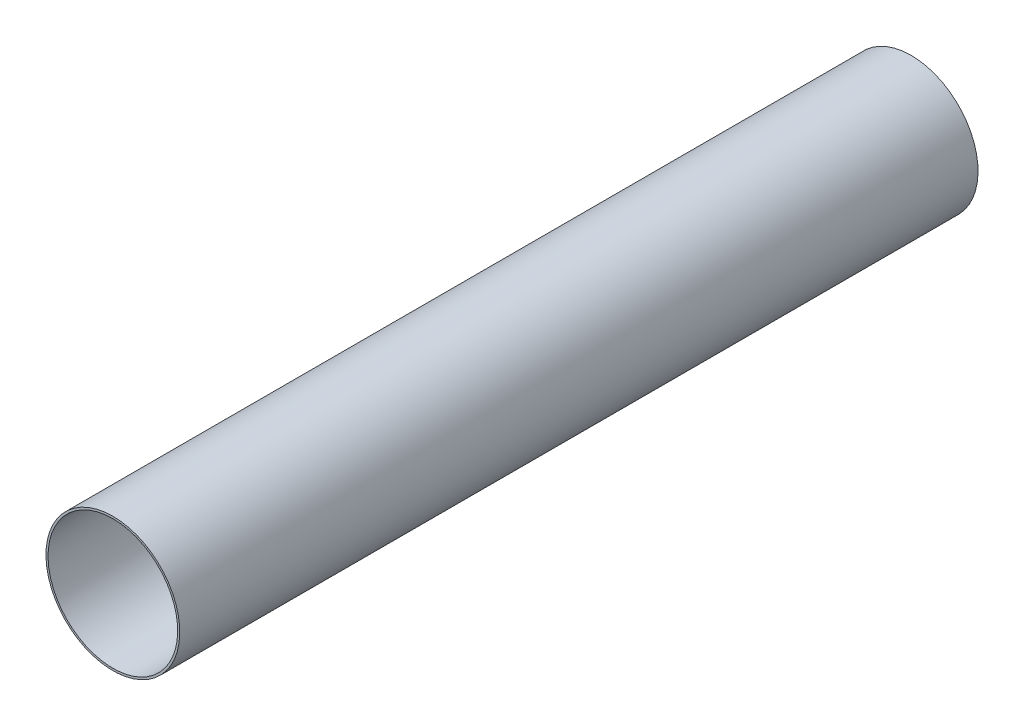
ISO-10303-21;
HEADER;
FILE_DESCRIPTION(('STEP AP214'),'2;1');
FILE_NAME('part.step','',(''),(''),'','','');
FILE_SCHEMA(('AUTOMOTIVE_DESIGN { 1 0 10303 214 1 1 1 1 }'));
ENDSEC;
DATA;
#1=APPLICATION_CONTEXT('core data for automotive mechanical design processes');
#2=APPLICATION_PROTOCOL_DEFINITION('international standard','automotive_design',2000,#1);
#3=PRODUCT_CONTEXT('',#1,'mechanical');
#4=PRODUCT('Part','Part','',(#3));
#5=PRODUCT_RELATED_PRODUCT_CATEGORY('part','',(#4));
#6=PRODUCT_DEFINITION_FORMATION('','',#4);
#7=PRODUCT_DEFINITION_CONTEXT('part definition',#1,'design');
#8=PRODUCT_DEFINITION('design','',#6,#7);
#9=PRODUCT_DEFINITION_SHAPE('','',#8);
#10=(LENGTH_UNIT() NAMED_UNIT(*) SI_UNIT(.MILLI.,.METRE.));
#11=(NAMED_UNIT(*) PLANE_ANGLE_UNIT() SI_UNIT($,.RADIAN.));
#12=(NAMED_UNIT(*) SI_UNIT($,.STERADIAN.) SOLID_ANGLE_UNIT());
#13=UNCERTAINTY_MEASURE_WITH_UNIT(LENGTH_MEASURE(1.E-05),#10,'distance_accuracy_value','');
#14=(GEOMETRIC_REPRESENTATION_CONTEXT(3) GLOBAL_UNCERTAINTY_ASSIGNED_CONTEXT((#13)) GLOBAL_UNIT_ASSIGNED_CONTEXT((#10,
#11,#12)) REPRESENTATION_CONTEXT('',''));
#15=CARTESIAN_POINT('',(0.,0.,0.));
#16=DIRECTION('',(0.,0.,1.));
#17=DIRECTION('',(1.,0.,0.));
#18=AXIS2_PLACEMENT_3D('',#15,#16,#17);
#19=CARTESIAN_POINT('',(0.,0.,0.));
#20=DIRECTION('',(0.,0.,-1.));
#21=DIRECTION('',(0.,1.,0.));
#22=AXIS2_PLACEMENT_3D('',#19,#20,#21);
#23=CYLINDRICAL_SURFACE('',#22,49.53);
#24=CARTESIAN_POINT('',(0.,0.,10.));
#25=DIRECTION('',(0.,0.,-1.));
#26=DIRECTION('',(0.,1.,0.));
#27=AXIS2_PLACEMENT_3D('',#24,#25,#26);
#28=CIRCLE('',#27,49.53);
#29=CARTESIAN_POINT('',(0.,49.53,10.));
#30=VERTEX_POINT('',#29);
#31=EDGE_CURVE('E45',#30,#30,#28,.T.);
#32=ORIENTED_EDGE('',*,*,#31,.T.);
#33=EDGE_LOOP('',(#32));
#34=FACE_BOUND('',#33,.T.);
#35=CARTESIAN_POINT('',(0.,0.,620.));
#36=DIRECTION('',(0.,0.,-1.));
#37=DIRECTION('',(0.,1.,0.));
#38=AXIS2_PLACEMENT_3D('',#35,#36,#37);
#39=CIRCLE('',#38,49.53);
#40=CARTESIAN_POINT('',(0.,49.5299999999999,620.));
#41=VERTEX_POINT('',#40);
#42=EDGE_CURVE('E10',#41,#41,#39,.T.);
#43=ORIENTED_EDGE('',*,*,#42,.F.);
#44=EDGE_LOOP('',(#43));
#45=FACE_BOUND('',#44,.T.);
#46=ADVANCED_FACE('F31',(#34,#45),#23,.F.);
#47=CARTESIAN_POINT('',(0.,49.5299999999999,620.));
#48=DIRECTION('',(0.,0.,1.));
#49=DIRECTION('',(0.,-1.,0.));
#50=AXIS2_PLACEMENT_3D('',#47,#48,#49);
#51=PLANE('',#50);
#52=ORIENTED_EDGE('',*,*,#42,.T.);
#53=EDGE_LOOP('',(#52));
#54=FACE_BOUND('',#53,.T.);
#55=CARTESIAN_POINT('',(0.,0.,620.));
#56=DIRECTION('',(0.,0.,-1.));
#57=DIRECTION('',(0.,1.,0.));
#58=AXIS2_PLACEMENT_3D('',#55,#56,#57);
#59=CIRCLE('',#58,51.11);
#60=CARTESIAN_POINT('',(0.,51.1099999999999,620.));
#61=VERTEX_POINT('',#60);
#62=EDGE_CURVE('E37',#61,#61,#59,.T.);
#63=ORIENTED_EDGE('',*,*,#62,.F.);
#64=EDGE_LOOP('',(#63));
#65=FACE_BOUND('',#64,.T.);
#66=ADVANCED_FACE('F61',(#54,#65),#51,.T.);
#67=CARTESIAN_POINT('',(0.,0.,0.));
#68=DIRECTION('',(0.,0.,-1.));
#69=DIRECTION('',(0.,1.,0.));
#70=AXIS2_PLACEMENT_3D('',#67,#68,#69);
#71=CYLINDRICAL_SURFACE('',#70,51.1099999999999);
#72=ORIENTED_EDGE('',*,*,#62,.T.);
#73=EDGE_LOOP('',(#72));
#74=FACE_BOUND('',#73,.T.);
#75=CARTESIAN_POINT('',(0.,0.,10.));
#76=DIRECTION('',(0.,0.,-1.));
#77=DIRECTION('',(0.,1.,0.));
#78=AXIS2_PLACEMENT_3D('',#75,#76,#77);
#79=CIRCLE('',#78,51.1099999999999);
#80=CARTESIAN_POINT('',(0.,51.1099999999999,10.));
#81=VERTEX_POINT('',#80);
#82=EDGE_CURVE('E41',#81,#81,#79,.T.);
#83=ORIENTED_EDGE('',*,*,#82,.F.);
#84=EDGE_LOOP('',(#83));
#85=FACE_BOUND('',#84,.T.);
#86=ADVANCED_FACE('F55',(#74,#85),#71,.T.);
#87=CARTESIAN_POINT('',(0.,51.1099999999999,10.));
#88=DIRECTION('',(0.,0.,-1.));
#89=DIRECTION('',(0.,1.,0.));
#90=AXIS2_PLACEMENT_3D('',#87,#88,#89);
#91=PLANE('',#90);
#92=ORIENTED_EDGE('',*,*,#82,.T.);
#93=EDGE_LOOP('',(#92));
#94=FACE_BOUND('',#93,.T.);
#95=ORIENTED_EDGE('',*,*,#31,.F.);
#96=EDGE_LOOP('',(#95));
#97=FACE_BOUND('',#96,.T.);
#98=ADVANCED_FACE('F53',(#94,#97),#91,.T.);
#99=CLOSED_SHELL('',(#46,#66,#86,#98));
#100=MANIFOLD_SOLID_BREP('B2',#99);
#101=ADVANCED_BREP_SHAPE_REPRESENTATION('',(#18,#100),#14);
#102=SHAPE_DEFINITION_REPRESENTATION(#9,#101);
ENDSEC;
END-ISO-10303-21;
